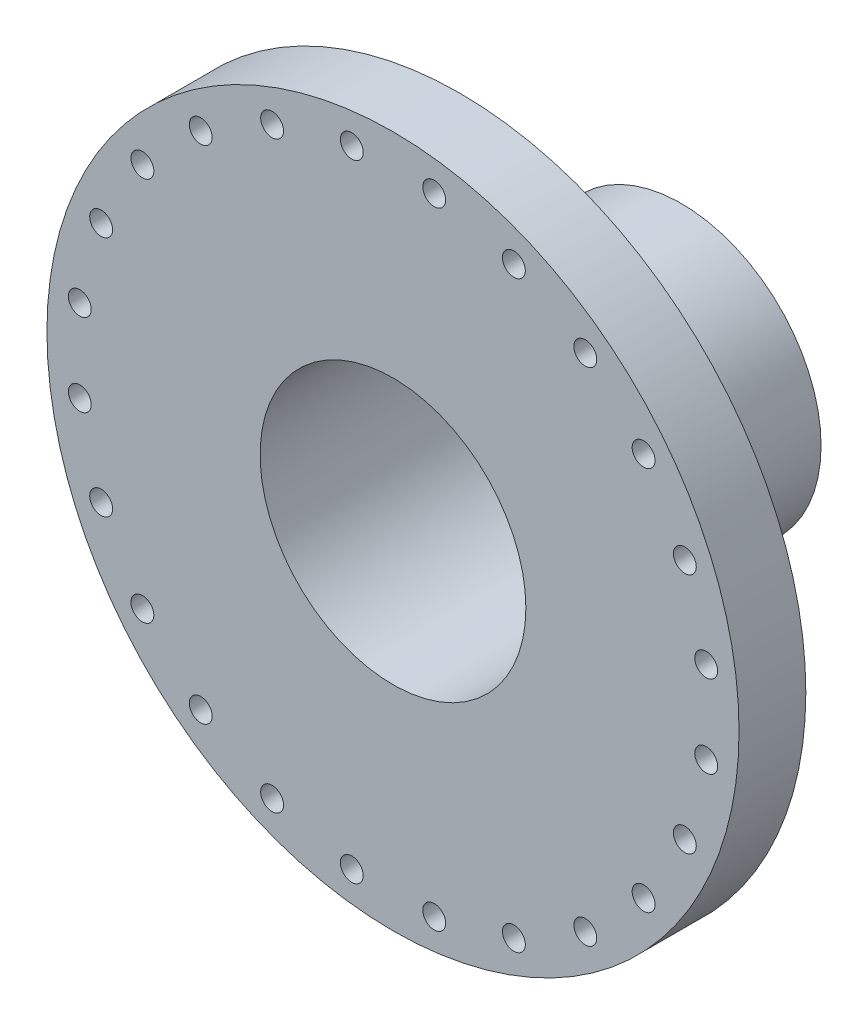
ISO-10303-21;
HEADER;
FILE_DESCRIPTION(('STEP AP214'),'2;1');
FILE_NAME('part.step','',(''),(''),'','','');
FILE_SCHEMA(('AUTOMOTIVE_DESIGN { 1 0 10303 214 1 1 1 1 }'));
ENDSEC;
DATA;
#1=APPLICATION_CONTEXT('core data for automotive mechanical design processes');
#2=APPLICATION_PROTOCOL_DEFINITION('international standard','automotive_design',2000,#1);
#3=PRODUCT_CONTEXT('',#1,'mechanical');
#4=PRODUCT('Part','Part','',(#3));
#5=PRODUCT_RELATED_PRODUCT_CATEGORY('part','',(#4));
#6=PRODUCT_DEFINITION_FORMATION('','',#4);
#7=PRODUCT_DEFINITION_CONTEXT('part definition',#1,'design');
#8=PRODUCT_DEFINITION('design','',#6,#7);
#9=PRODUCT_DEFINITION_SHAPE('','',#8);
#10=(LENGTH_UNIT() NAMED_UNIT(*) SI_UNIT(.MILLI.,.METRE.));
#11=(NAMED_UNIT(*) PLANE_ANGLE_UNIT() SI_UNIT($,.RADIAN.));
#12=(NAMED_UNIT(*) SI_UNIT($,.STERADIAN.) SOLID_ANGLE_UNIT());
#13=UNCERTAINTY_MEASURE_WITH_UNIT(LENGTH_MEASURE(1.E-05),#10,'distance_accuracy_value','');
#14=(GEOMETRIC_REPRESENTATION_CONTEXT(3) GLOBAL_UNCERTAINTY_ASSIGNED_CONTEXT((#13)) GLOBAL_UNIT_ASSIGNED_CONTEXT((#10,
#11,#12)) REPRESENTATION_CONTEXT('',''));
#15=CARTESIAN_POINT('',(0.,0.,0.));
#16=DIRECTION('',(0.,0.,1.));
#17=DIRECTION('',(1.,0.,0.));
#18=AXIS2_PLACEMENT_3D('',#15,#16,#17);
#19=CARTESIAN_POINT('',(0.,0.,-81.28));
#20=DIRECTION('',(0.,0.,1.));
#21=DIRECTION('',(1.,0.,0.));
#22=AXIS2_PLACEMENT_3D('',#19,#20,#21);
#23=CYLINDRICAL_SURFACE('',#22,48.768);
#24=CARTESIAN_POINT('',(0.,0.,24.511));
#25=DIRECTION('',(0.,0.,1.));
#26=DIRECTION('',(1.,0.,0.));
#27=AXIS2_PLACEMENT_3D('',#24,#25,#26);
#28=CIRCLE('',#27,48.768);
#29=CARTESIAN_POINT('',(48.768,0.,24.511));
#30=VERTEX_POINT('',#29);
#31=EDGE_CURVE('E50',#30,#30,#28,.T.);
#32=ORIENTED_EDGE('',*,*,#31,.T.);
#33=EDGE_LOOP('',(#32));
#34=FACE_BOUND('',#33,.T.);
#35=CARTESIAN_POINT('',(0.,0.,-78.74));
#36=DIRECTION('',(0.,0.,-1.));
#37=DIRECTION('',(-1.,0.,0.));
#38=AXIS2_PLACEMENT_3D('',#35,#36,#37);
#39=CIRCLE('',#38,48.768);
#40=CARTESIAN_POINT('',(-48.768,0.,-78.74));
#41=VERTEX_POINT('',#40);
#42=EDGE_CURVE('E10',#41,#41,#39,.F.);
#43=ORIENTED_EDGE('',*,*,#42,.F.);
#44=EDGE_LOOP('',(#43));
#45=FACE_BOUND('',#44,.T.);
#46=ADVANCED_FACE('F29',(#34,#45),#23,.F.);
#47=CARTESIAN_POINT('',(0.,0.,-81.28));
#48=DIRECTION('',(0.,0.,1.));
#49=DIRECTION('',(1.,0.,0.));
#50=AXIS2_PLACEMENT_3D('',#47,#48,#49);
#51=CYLINDRICAL_SURFACE('',#50,51.308);
#52=CARTESIAN_POINT('',(0.,0.,-81.28));
#53=DIRECTION('',(0.,0.,1.));
#54=DIRECTION('',(1.,0.,0.));
#55=AXIS2_PLACEMENT_3D('',#52,#53,#54);
#56=CIRCLE('',#55,51.308);
#57=CARTESIAN_POINT('',(51.308,0.,-81.28));
#58=VERTEX_POINT('',#57);
#59=EDGE_CURVE('E36',#58,#58,#56,.T.);
#60=ORIENTED_EDGE('',*,*,#59,.T.);
#61=EDGE_LOOP('',(#60));
#62=FACE_BOUND('',#61,.T.);
#63=CARTESIAN_POINT('',(0.,0.,0.));
#64=DIRECTION('',(0.,0.,1.));
#65=DIRECTION('',(1.,0.,0.));
#66=AXIS2_PLACEMENT_3D('',#63,#64,#65);
#67=CIRCLE('',#66,51.308);
#68=CARTESIAN_POINT('',(51.308,0.,0.));
#69=VERTEX_POINT('',#68);
#70=EDGE_CURVE('E40',#69,#69,#67,.T.);
#71=ORIENTED_EDGE('',*,*,#70,.F.);
#72=EDGE_LOOP('',(#71));
#73=FACE_BOUND('',#72,.T.);
#74=ADVANCED_FACE('F31',(#62,#73),#51,.T.);
#75=CARTESIAN_POINT('',(0.,0.,-81.28));
#76=DIRECTION('',(0.,0.,1.));
#77=DIRECTION('',(1.,0.,0.));
#78=AXIS2_PLACEMENT_3D('',#75,#76,#77);
#79=PLANE('',#78);
#80=ORIENTED_EDGE('',*,*,#59,.F.);
#81=EDGE_LOOP('',(#80));
#82=FACE_BOUND('',#81,.T.);
#83=CARTESIAN_POINT('',(0.,0.,-81.28));
#84=DIRECTION('',(0.,0.,-1.));
#85=DIRECTION('',(-1.,0.,0.));
#86=AXIS2_PLACEMENT_3D('',#83,#84,#85);
#87=CIRCLE('',#86,25.4);
#88=CARTESIAN_POINT('',(-25.4,0.,-81.28));
#89=VERTEX_POINT('',#88);
#90=EDGE_CURVE('E200',#89,#89,#87,.T.);
#91=ORIENTED_EDGE('',*,*,#90,.F.);
#92=EDGE_LOOP('',(#91));
#93=FACE_BOUND('',#92,.T.);
#94=ADVANCED_FACE('F214',(#82,#93),#79,.F.);
#95=CARTESIAN_POINT('',(0.,0.,24.511));
#96=DIRECTION('',(0.,0.,1.));
#97=DIRECTION('',(1.,0.,0.));
#98=AXIS2_PLACEMENT_3D('',#95,#96,#97);
#99=PLANE('',#98);
#100=CARTESIAN_POINT('',(-15.1313271488224,-114.933840421676,24.511));
#101=DIRECTION('',(0.,0.,1.));
#102=DIRECTION('',(0.965925826289072,-0.258819045102508,0.));
#103=AXIS2_PLACEMENT_3D('',#100,#101,#102);
#104=CIRCLE('',#103,4.20000000000002);
#105=CARTESIAN_POINT('',(-11.0744386784083,-116.020880411107,24.511));
#106=VERTEX_POINT('',#105);
#107=EDGE_CURVE('E196',#106,#106,#104,.T.);
#108=ORIENTED_EDGE('',*,*,#107,.F.);
#109=EDGE_LOOP('',(#108));
#110=FACE_BOUND('',#109,.T.);
#111=CARTESIAN_POINT('',(-44.3628065069803,-107.101289134091,24.511));
#112=DIRECTION('',(0.,0.,1.));
#113=DIRECTION('',(0.866025403784445,-0.499999999999989,0.));
#114=AXIS2_PLACEMENT_3D('',#111,#112,#113);
#115=CIRCLE('',#114,4.20000000000002);
#116=CARTESIAN_POINT('',(-40.7254998110856,-109.201289134091,24.511));
#117=VERTEX_POINT('',#116);
#118=EDGE_CURVE('E190',#117,#117,#115,.T.);
#119=ORIENTED_EDGE('',*,*,#118,.F.);
#120=EDGE_LOOP('',(#119));
#121=FACE_BOUND('',#120,.T.);
#122=CARTESIAN_POINT('',(-70.5710339146915,-91.969961985267,24.511));
#123=DIRECTION('',(0.,0.,1.));
#124=DIRECTION('',(0.707106781186556,-0.707106781186539,0.));
#125=AXIS2_PLACEMENT_3D('',#122,#123,#124);
#126=CIRCLE('',#125,4.20000000000002);
#127=CARTESIAN_POINT('',(-67.601185433708,-94.9398104662504,24.511));
#128=VERTEX_POINT('',#127);
#129=EDGE_CURVE('E184',#128,#128,#126,.T.);
#130=ORIENTED_EDGE('',*,*,#129,.F.);
#131=EDGE_LOOP('',(#130));
#132=FACE_BOUND('',#131,.T.);
#133=CARTESIAN_POINT('',(-91.9699619852642,-70.5710339146951,24.511));
#134=DIRECTION('',(0.,0.,1.));
#135=DIRECTION('',(0.50000000000001,-0.866025403784433,0.));
#136=AXIS2_PLACEMENT_3D('',#133,#134,#135);
#137=CIRCLE('',#136,4.20000000000002);
#138=CARTESIAN_POINT('',(-89.8699619852642,-74.2083406105897,24.511));
#139=VERTEX_POINT('',#138);
#140=EDGE_CURVE('E178',#139,#139,#137,.T.);
#141=ORIENTED_EDGE('',*,*,#140,.F.);
#142=EDGE_LOOP('',(#141));
#143=FACE_BOUND('',#142,.T.);
#144=CARTESIAN_POINT('',(-107.10128913409,-44.3628065069844,24.511));
#145=DIRECTION('',(0.,0.,1.));
#146=DIRECTION('',(0.258819045102531,-0.965925826289065,0.));
#147=AXIS2_PLACEMENT_3D('',#144,#145,#146);
#148=CIRCLE('',#147,4.20000000000002);
#149=CARTESIAN_POINT('',(-106.014249144659,-48.4196949773985,24.511));
#150=VERTEX_POINT('',#149);
#151=EDGE_CURVE('E172',#150,#150,#148,.T.);
#152=ORIENTED_EDGE('',*,*,#151,.F.);
#153=EDGE_LOOP('',(#152));
#154=FACE_BOUND('',#153,.T.);
#155=CARTESIAN_POINT('',(-114.933840421676,-15.1313271488269,24.511));
#156=DIRECTION('',(0.,0.,1.));
#157=DIRECTION('',(0.,-1.,0.));
#158=AXIS2_PLACEMENT_3D('',#155,#156,#157);
#159=CIRCLE('',#158,4.20000000000002);
#160=CARTESIAN_POINT('',(-114.933840421675,-19.3313271488269,24.511));
#161=VERTEX_POINT('',#160);
#162=EDGE_CURVE('E166',#161,#161,#159,.T.);
#163=ORIENTED_EDGE('',*,*,#162,.F.);
#164=EDGE_LOOP('',(#163));
#165=FACE_BOUND('',#164,.T.);
#166=CARTESIAN_POINT('',(-114.933840421676,15.1313271488228,24.511));
#167=DIRECTION('',(0.,0.,1.));
#168=DIRECTION('',(-0.258819045102511,-0.965925826289071,0.));
#169=AXIS2_PLACEMENT_3D('',#166,#167,#168);
#170=CIRCLE('',#169,4.20000000000002);
#171=CARTESIAN_POINT('',(-116.020880411107,11.0744386784087,24.511));
#172=VERTEX_POINT('',#171);
#173=EDGE_CURVE('E160',#172,#172,#170,.T.);
#174=ORIENTED_EDGE('',*,*,#173,.F.);
#175=EDGE_LOOP('',(#174));
#176=FACE_BOUND('',#175,.T.);
#177=CARTESIAN_POINT('',(-107.101289134091,44.3628065069807,24.511));
#178=DIRECTION('',(0.,0.,1.));
#179=DIRECTION('',(-0.499999999999992,-0.866025403784443,0.));
#180=AXIS2_PLACEMENT_3D('',#177,#178,#179);
#181=CIRCLE('',#180,4.20000000000002);
#182=CARTESIAN_POINT('',(-109.201289134091,40.725499811086,24.511));
#183=VERTEX_POINT('',#182);
#184=EDGE_CURVE('E154',#183,#183,#181,.T.);
#185=ORIENTED_EDGE('',*,*,#184,.F.);
#186=EDGE_LOOP('',(#185));
#187=FACE_BOUND('',#186,.T.);
#188=CARTESIAN_POINT('',(-91.9699619852667,70.5710339146919,24.511));
#189=DIRECTION('',(0.,0.,1.));
#190=DIRECTION('',(-0.707106781186541,-0.707106781186554,0.));
#191=AXIS2_PLACEMENT_3D('',#188,#189,#190);
#192=CIRCLE('',#191,4.20000000000002);
#193=CARTESIAN_POINT('',(-94.9398104662502,67.6011854337083,24.511));
#194=VERTEX_POINT('',#193);
#195=EDGE_CURVE('E148',#194,#194,#192,.T.);
#196=ORIENTED_EDGE('',*,*,#195,.F.);
#197=EDGE_LOOP('',(#196));
#198=FACE_BOUND('',#197,.T.);
#199=CARTESIAN_POINT('',(-70.5710339146947,91.9699619852645,24.511));
#200=DIRECTION('',(0.,0.,1.));
#201=DIRECTION('',(-0.866025403784435,-0.500000000000007,0.));
#202=AXIS2_PLACEMENT_3D('',#199,#200,#201);
#203=CIRCLE('',#202,4.20000000000002);
#204=CARTESIAN_POINT('',(-74.2083406105894,89.8699619852645,24.511));
#205=VERTEX_POINT('',#204);
#206=EDGE_CURVE('E142',#205,#205,#203,.T.);
#207=ORIENTED_EDGE('',*,*,#206,.F.);
#208=EDGE_LOOP('',(#207));
#209=FACE_BOUND('',#208,.T.);
#210=CARTESIAN_POINT('',(-44.362806506984,107.10128913409,24.511));
#211=DIRECTION('',(0.,0.,1.));
#212=DIRECTION('',(-0.965925826289066,-0.258819045102528,0.));
#213=AXIS2_PLACEMENT_3D('',#210,#211,#212);
#214=CIRCLE('',#213,4.20000000000002);
#215=CARTESIAN_POINT('',(-48.4196949773981,106.014249144659,24.511));
#216=VERTEX_POINT('',#215);
#217=EDGE_CURVE('E136',#216,#216,#214,.T.);
#218=ORIENTED_EDGE('',*,*,#217,.F.);
#219=EDGE_LOOP('',(#218));
#220=FACE_BOUND('',#219,.T.);
#221=CARTESIAN_POINT('',(-15.1313271488265,114.933840421676,24.511));
#222=DIRECTION('',(0.,0.,1.));
#223=DIRECTION('',(-1.,0.,0.));
#224=AXIS2_PLACEMENT_3D('',#221,#222,#223);
#225=CIRCLE('',#224,4.20000000000002);
#226=CARTESIAN_POINT('',(-19.3313271488265,114.933840421676,24.511));
#227=VERTEX_POINT('',#226);
#228=EDGE_CURVE('E130',#227,#227,#225,.T.);
#229=ORIENTED_EDGE('',*,*,#228,.F.);
#230=EDGE_LOOP('',(#229));
#231=FACE_BOUND('',#230,.T.);
#232=CARTESIAN_POINT('',(15.1313271488232,114.933840421676,24.511));
#233=DIRECTION('',(0.,0.,1.));
#234=DIRECTION('',(-0.96592582628907,0.258819045102515,0.));
#235=AXIS2_PLACEMENT_3D('',#232,#233,#234);
#236=CIRCLE('',#235,4.20000000000002);
#237=CARTESIAN_POINT('',(11.0744386784091,116.020880411107,24.511));
#238=VERTEX_POINT('',#237);
#239=EDGE_CURVE('E124',#238,#238,#236,.T.);
#240=ORIENTED_EDGE('',*,*,#239,.F.);
#241=EDGE_LOOP('',(#240));
#242=FACE_BOUND('',#241,.T.);
#243=CARTESIAN_POINT('',(44.362806506981,107.101289134091,24.511));
#244=DIRECTION('',(0.,0.,1.));
#245=DIRECTION('',(-0.866025403784442,0.499999999999995,0.));
#246=AXIS2_PLACEMENT_3D('',#243,#244,#245);
#247=CIRCLE('',#246,4.20000000000002);
#248=CARTESIAN_POINT('',(40.7254998110864,109.201289134091,24.511));
#249=VERTEX_POINT('',#248);
#250=EDGE_CURVE('E118',#249,#249,#247,.T.);
#251=ORIENTED_EDGE('',*,*,#250,.F.);
#252=EDGE_LOOP('',(#251));
#253=FACE_BOUND('',#252,.T.);
#254=CARTESIAN_POINT('',(70.5710339146922,91.9699619852665,24.511));
#255=DIRECTION('',(0.,0.,1.));
#256=DIRECTION('',(-0.707106781186551,0.707106781186544,0.));
#257=AXIS2_PLACEMENT_3D('',#254,#255,#256);
#258=CIRCLE('',#257,4.20000000000002);
#259=CARTESIAN_POINT('',(67.6011854337087,94.93981046625,24.511));
#260=VERTEX_POINT('',#259);
#261=EDGE_CURVE('E112',#260,#260,#258,.T.);
#262=ORIENTED_EDGE('',*,*,#261,.F.);
#263=EDGE_LOOP('',(#262));
#264=FACE_BOUND('',#263,.T.);
#265=CARTESIAN_POINT('',(91.9699619852648,70.5710339146945,24.511));
#266=DIRECTION('',(0.,0.,1.));
#267=DIRECTION('',(-0.500000000000004,0.866025403784436,0.));
#268=AXIS2_PLACEMENT_3D('',#265,#266,#267);
#269=CIRCLE('',#268,4.20000000000002);
#270=CARTESIAN_POINT('',(89.8699619852648,74.2083406105891,24.511));
#271=VERTEX_POINT('',#270);
#272=EDGE_CURVE('E106',#271,#271,#269,.T.);
#273=ORIENTED_EDGE('',*,*,#272,.F.);
#274=EDGE_LOOP('',(#273));
#275=FACE_BOUND('',#274,.T.);
#276=CARTESIAN_POINT('',(107.10128913409,44.3628065069837,24.511));
#277=DIRECTION('',(0.,0.,1.));
#278=DIRECTION('',(-0.258819045102525,0.965925826289067,0.));
#279=AXIS2_PLACEMENT_3D('',#276,#277,#278);
#280=CIRCLE('',#279,4.20000000000002);
#281=CARTESIAN_POINT('',(106.014249144659,48.4196949773978,24.511));
#282=VERTEX_POINT('',#281);
#283=EDGE_CURVE('E100',#282,#282,#280,.T.);
#284=ORIENTED_EDGE('',*,*,#283,.F.);
#285=EDGE_LOOP('',(#284));
#286=FACE_BOUND('',#285,.T.);
#287=CARTESIAN_POINT('',(114.933840421676,15.131327148826,24.511));
#288=DIRECTION('',(0.,0.,1.));
#289=DIRECTION('',(0.,1.,0.));
#290=AXIS2_PLACEMENT_3D('',#287,#288,#289);
#291=CIRCLE('',#290,4.20000000000002);
#292=CARTESIAN_POINT('',(114.933840421676,19.3313271488261,24.511));
#293=VERTEX_POINT('',#292);
#294=EDGE_CURVE('E94',#293,#293,#291,.T.);
#295=ORIENTED_EDGE('',*,*,#294,.F.);
#296=EDGE_LOOP('',(#295));
#297=FACE_BOUND('',#296,.T.);
#298=CARTESIAN_POINT('',(114.933840421676,-15.1313271488236,24.511));
#299=DIRECTION('',(0.,0.,1.));
#300=DIRECTION('',(0.258819045102518,0.965925826289069,0.));
#301=AXIS2_PLACEMENT_3D('',#298,#299,#300);
#302=CIRCLE('',#301,4.20000000000002);
#303=CARTESIAN_POINT('',(116.020880411107,-11.0744386784095,24.511));
#304=VERTEX_POINT('',#303);
#305=EDGE_CURVE('E88',#304,#304,#302,.T.);
#306=ORIENTED_EDGE('',*,*,#305,.F.);
#307=EDGE_LOOP('',(#306));
#308=FACE_BOUND('',#307,.T.);
#309=CARTESIAN_POINT('',(107.101289134091,-44.3628065069814,24.511));
#310=DIRECTION('',(0.,0.,1.));
#311=DIRECTION('',(0.499999999999998,0.86602540378444,0.));
#312=AXIS2_PLACEMENT_3D('',#309,#310,#311);
#313=CIRCLE('',#312,4.20000000000002);
#314=CARTESIAN_POINT('',(109.201289134091,-40.7254998110868,24.511));
#315=VERTEX_POINT('',#314);
#316=EDGE_CURVE('E82',#315,#315,#313,.T.);
#317=ORIENTED_EDGE('',*,*,#316,.F.);
#318=EDGE_LOOP('',(#317));
#319=FACE_BOUND('',#318,.T.);
#320=CARTESIAN_POINT('',(91.9699619852663,-70.5710339146925,24.511));
#321=DIRECTION('',(0.,0.,1.));
#322=DIRECTION('',(0.707106781186546,0.707106781186549,0.));
#323=AXIS2_PLACEMENT_3D('',#320,#321,#322);
#324=CIRCLE('',#323,4.20000000000002);
#325=CARTESIAN_POINT('',(94.9398104662498,-67.601185433709,24.511));
#326=VERTEX_POINT('',#325);
#327=EDGE_CURVE('E76',#326,#326,#324,.T.);
#328=ORIENTED_EDGE('',*,*,#327,.F.);
#329=EDGE_LOOP('',(#328));
#330=FACE_BOUND('',#329,.T.);
#331=CARTESIAN_POINT('',(70.5710339146942,-91.969961985265,24.511));
#332=DIRECTION('',(0.,0.,1.));
#333=DIRECTION('',(0.866025403784438,0.500000000000001,0.));
#334=AXIS2_PLACEMENT_3D('',#331,#332,#333);
#335=CIRCLE('',#334,4.20000000000002);
#336=CARTESIAN_POINT('',(74.2083406105888,-89.869961985265,24.511));
#337=VERTEX_POINT('',#336);
#338=EDGE_CURVE('E70',#337,#337,#335,.T.);
#339=ORIENTED_EDGE('',*,*,#338,.F.);
#340=EDGE_LOOP('',(#339));
#341=FACE_BOUND('',#340,.T.);
#342=CARTESIAN_POINT('',(44.3628065069833,-107.10128913409,24.511));
#343=DIRECTION('',(0.,0.,1.));
#344=DIRECTION('',(0.965925826289068,0.258819045102521,0.));
#345=AXIS2_PLACEMENT_3D('',#342,#343,#344);
#346=CIRCLE('',#345,4.20000000000002);
#347=CARTESIAN_POINT('',(48.4196949773974,-106.014249144659,24.511));
#348=VERTEX_POINT('',#347);
#349=EDGE_CURVE('E64',#348,#348,#346,.T.);
#350=ORIENTED_EDGE('',*,*,#349,.F.);
#351=EDGE_LOOP('',(#350));
#352=FACE_BOUND('',#351,.T.);
#353=CARTESIAN_POINT('',(15.1313271488256,-114.933840421676,24.511));
#354=DIRECTION('',(0.,0.,1.));
#355=DIRECTION('',(1.,0.,0.));
#356=AXIS2_PLACEMENT_3D('',#353,#354,#355);
#357=CIRCLE('',#356,4.20000000000002);
#358=CARTESIAN_POINT('',(19.3313271488257,-114.933840421676,24.511));
#359=VERTEX_POINT('',#358);
#360=EDGE_CURVE('E58',#359,#359,#357,.T.);
#361=ORIENTED_EDGE('',*,*,#360,.F.);
#362=EDGE_LOOP('',(#361));
#363=FACE_BOUND('',#362,.T.);
#364=CARTESIAN_POINT('',(0.,0.,24.511));
#365=DIRECTION('',(0.,0.,1.));
#366=DIRECTION('',(1.,0.,0.));
#367=AXIS2_PLACEMENT_3D('',#364,#365,#366);
#368=CIRCLE('',#367,127.);
#369=CARTESIAN_POINT('',(127.,0.,24.511));
#370=VERTEX_POINT('',#369);
#371=EDGE_CURVE('E45',#370,#370,#368,.T.);
#372=ORIENTED_EDGE('',*,*,#371,.T.);
#373=EDGE_LOOP('',(#372));
#374=FACE_BOUND('',#373,.T.);
#375=ORIENTED_EDGE('',*,*,#31,.F.);
#376=EDGE_LOOP('',(#375));
#377=FACE_BOUND('',#376,.T.);
#378=ADVANCED_FACE('F216',(#110,#121,#132,#143,#154,#165,#176,#187,#198,#209,#220,#231,#242,
#253,#264,#275,#286,#297,#308,#319,#330,#341,#352,#363,#374,#377),#99,.T.);
#379=CARTESIAN_POINT('',(0.,0.,0.));
#380=DIRECTION('',(0.,0.,1.));
#381=DIRECTION('',(1.,0.,0.));
#382=AXIS2_PLACEMENT_3D('',#379,#380,#381);
#383=PLANE('',#382);
#384=CARTESIAN_POINT('',(-15.1313271488224,-114.933840421676,0.));
#385=DIRECTION('',(0.,0.,1.));
#386=DIRECTION('',(1.,0.,0.));
#387=AXIS2_PLACEMENT_3D('',#384,#385,#386);
#388=CIRCLE('',#387,4.20000000000002);
#389=CARTESIAN_POINT('',(-10.9313271488224,-114.933840421676,0.));
#390=VERTEX_POINT('',#389);
#391=EDGE_CURVE('E193',#390,#390,#388,.F.);
#392=ORIENTED_EDGE('',*,*,#391,.F.);
#393=EDGE_LOOP('',(#392));
#394=FACE_BOUND('',#393,.T.);
#395=CARTESIAN_POINT('',(-44.3628065069803,-107.101289134091,0.));
#396=DIRECTION('',(0.,0.,1.));
#397=DIRECTION('',(1.,0.,0.));
#398=AXIS2_PLACEMENT_3D('',#395,#396,#397);
#399=CIRCLE('',#398,4.20000000000002);
#400=CARTESIAN_POINT('',(-40.1628065069803,-107.101289134091,0.));
#401=VERTEX_POINT('',#400);
#402=EDGE_CURVE('E187',#401,#401,#399,.F.);
#403=ORIENTED_EDGE('',*,*,#402,.F.);
#404=EDGE_LOOP('',(#403));
#405=FACE_BOUND('',#404,.T.);
#406=CARTESIAN_POINT('',(-70.5710339146916,-91.969961985267,0.));
#407=DIRECTION('',(0.,0.,1.));
#408=DIRECTION('',(1.,0.,0.));
#409=AXIS2_PLACEMENT_3D('',#406,#407,#408);
#410=CIRCLE('',#409,4.20000000000002);
#411=CARTESIAN_POINT('',(-66.3710339146915,-91.969961985267,0.));
#412=VERTEX_POINT('',#411);
#413=EDGE_CURVE('E181',#412,#412,#410,.F.);
#414=ORIENTED_EDGE('',*,*,#413,.F.);
#415=EDGE_LOOP('',(#414));
#416=FACE_BOUND('',#415,.T.);
#417=CARTESIAN_POINT('',(-91.9699619852643,-70.5710339146951,0.));
#418=DIRECTION('',(0.,0.,1.));
#419=DIRECTION('',(1.,0.,0.));
#420=AXIS2_PLACEMENT_3D('',#417,#418,#419);
#421=CIRCLE('',#420,4.20000000000002);
#422=CARTESIAN_POINT('',(-87.7699619852642,-70.5710339146951,0.));
#423=VERTEX_POINT('',#422);
#424=EDGE_CURVE('E175',#423,#423,#421,.F.);
#425=ORIENTED_EDGE('',*,*,#424,.F.);
#426=EDGE_LOOP('',(#425));
#427=FACE_BOUND('',#426,.T.);
#428=CARTESIAN_POINT('',(-107.10128913409,-44.3628065069844,0.));
#429=DIRECTION('',(0.,0.,1.));
#430=DIRECTION('',(1.,0.,0.));
#431=AXIS2_PLACEMENT_3D('',#428,#429,#430);
#432=CIRCLE('',#431,4.20000000000002);
#433=CARTESIAN_POINT('',(-102.90128913409,-44.3628065069844,0.));
#434=VERTEX_POINT('',#433);
#435=EDGE_CURVE('E169',#434,#434,#432,.F.);
#436=ORIENTED_EDGE('',*,*,#435,.F.);
#437=EDGE_LOOP('',(#436));
#438=FACE_BOUND('',#437,.T.);
#439=CARTESIAN_POINT('',(-114.933840421676,-15.1313271488269,0.));
#440=DIRECTION('',(0.,0.,1.));
#441=DIRECTION('',(1.,0.,0.));
#442=AXIS2_PLACEMENT_3D('',#439,#440,#441);
#443=CIRCLE('',#442,4.20000000000002);
#444=CARTESIAN_POINT('',(-110.733840421676,-15.1313271488269,0.));
#445=VERTEX_POINT('',#444);
#446=EDGE_CURVE('E163',#445,#445,#443,.F.);
#447=ORIENTED_EDGE('',*,*,#446,.F.);
#448=EDGE_LOOP('',(#447));
#449=FACE_BOUND('',#448,.T.);
#450=CARTESIAN_POINT('',(-114.933840421676,15.1313271488228,0.));
#451=DIRECTION('',(0.,0.,1.));
#452=DIRECTION('',(1.,0.,0.));
#453=AXIS2_PLACEMENT_3D('',#450,#451,#452);
#454=CIRCLE('',#453,4.20000000000002);
#455=CARTESIAN_POINT('',(-110.733840421676,15.1313271488228,0.));
#456=VERTEX_POINT('',#455);
#457=EDGE_CURVE('E157',#456,#456,#454,.F.);
#458=ORIENTED_EDGE('',*,*,#457,.F.);
#459=EDGE_LOOP('',(#458));
#460=FACE_BOUND('',#459,.T.);
#461=CARTESIAN_POINT('',(-107.101289134091,44.3628065069807,0.));
#462=DIRECTION('',(0.,0.,1.));
#463=DIRECTION('',(1.,0.,0.));
#464=AXIS2_PLACEMENT_3D('',#461,#462,#463);
#465=CIRCLE('',#464,4.20000000000002);
#466=CARTESIAN_POINT('',(-102.901289134091,44.3628065069807,0.));
#467=VERTEX_POINT('',#466);
#468=EDGE_CURVE('E151',#467,#467,#465,.F.);
#469=ORIENTED_EDGE('',*,*,#468,.F.);
#470=EDGE_LOOP('',(#469));
#471=FACE_BOUND('',#470,.T.);
#472=CARTESIAN_POINT('',(-91.9699619852667,70.5710339146919,0.));
#473=DIRECTION('',(0.,0.,1.));
#474=DIRECTION('',(1.,0.,0.));
#475=AXIS2_PLACEMENT_3D('',#472,#473,#474);
#476=CIRCLE('',#475,4.20000000000002);
#477=CARTESIAN_POINT('',(-87.7699619852667,70.5710339146919,0.));
#478=VERTEX_POINT('',#477);
#479=EDGE_CURVE('E145',#478,#478,#476,.F.);
#480=ORIENTED_EDGE('',*,*,#479,.F.);
#481=EDGE_LOOP('',(#480));
#482=FACE_BOUND('',#481,.T.);
#483=CARTESIAN_POINT('',(-70.5710339146948,91.9699619852645,0.));
#484=DIRECTION('',(0.,0.,1.));
#485=DIRECTION('',(1.,0.,0.));
#486=AXIS2_PLACEMENT_3D('',#483,#484,#485);
#487=CIRCLE('',#486,4.20000000000002);
#488=CARTESIAN_POINT('',(-66.3710339146948,91.9699619852645,0.));
#489=VERTEX_POINT('',#488);
#490=EDGE_CURVE('E139',#489,#489,#487,.F.);
#491=ORIENTED_EDGE('',*,*,#490,.F.);
#492=EDGE_LOOP('',(#491));
#493=FACE_BOUND('',#492,.T.);
#494=CARTESIAN_POINT('',(-44.362806506984,107.10128913409,0.));
#495=DIRECTION('',(0.,0.,1.));
#496=DIRECTION('',(1.,0.,0.));
#497=AXIS2_PLACEMENT_3D('',#494,#495,#496);
#498=CIRCLE('',#497,4.20000000000002);
#499=CARTESIAN_POINT('',(-40.162806506984,107.10128913409,0.));
#500=VERTEX_POINT('',#499);
#501=EDGE_CURVE('E133',#500,#500,#498,.F.);
#502=ORIENTED_EDGE('',*,*,#501,.F.);
#503=EDGE_LOOP('',(#502));
#504=FACE_BOUND('',#503,.T.);
#505=CARTESIAN_POINT('',(-15.1313271488265,114.933840421676,0.));
#506=DIRECTION('',(0.,0.,1.));
#507=DIRECTION('',(1.,0.,0.));
#508=AXIS2_PLACEMENT_3D('',#505,#506,#507);
#509=CIRCLE('',#508,4.20000000000002);
#510=CARTESIAN_POINT('',(-10.9313271488264,114.933840421676,0.));
#511=VERTEX_POINT('',#510);
#512=EDGE_CURVE('E127',#511,#511,#509,.F.);
#513=ORIENTED_EDGE('',*,*,#512,.F.);
#514=EDGE_LOOP('',(#513));
#515=FACE_BOUND('',#514,.T.);
#516=CARTESIAN_POINT('',(15.1313271488232,114.933840421676,0.));
#517=DIRECTION('',(0.,0.,1.));
#518=DIRECTION('',(1.,0.,0.));
#519=AXIS2_PLACEMENT_3D('',#516,#517,#518);
#520=CIRCLE('',#519,4.20000000000002);
#521=CARTESIAN_POINT('',(19.3313271488233,114.933840421676,0.));
#522=VERTEX_POINT('',#521);
#523=EDGE_CURVE('E121',#522,#522,#520,.F.);
#524=ORIENTED_EDGE('',*,*,#523,.F.);
#525=EDGE_LOOP('',(#524));
#526=FACE_BOUND('',#525,.T.);
#527=CARTESIAN_POINT('',(44.362806506981,107.101289134091,0.));
#528=DIRECTION('',(0.,0.,1.));
#529=DIRECTION('',(1.,0.,0.));
#530=AXIS2_PLACEMENT_3D('',#527,#528,#529);
#531=CIRCLE('',#530,4.20000000000002);
#532=CARTESIAN_POINT('',(48.5628065069811,107.101289134091,0.));
#533=VERTEX_POINT('',#532);
#534=EDGE_CURVE('E115',#533,#533,#531,.F.);
#535=ORIENTED_EDGE('',*,*,#534,.F.);
#536=EDGE_LOOP('',(#535));
#537=FACE_BOUND('',#536,.T.);
#538=CARTESIAN_POINT('',(70.5710339146922,91.9699619852665,0.));
#539=DIRECTION('',(0.,0.,1.));
#540=DIRECTION('',(1.,0.,0.));
#541=AXIS2_PLACEMENT_3D('',#538,#539,#540);
#542=CIRCLE('',#541,4.20000000000002);
#543=CARTESIAN_POINT('',(74.7710339146922,91.9699619852665,0.));
#544=VERTEX_POINT('',#543);
#545=EDGE_CURVE('E109',#544,#544,#542,.F.);
#546=ORIENTED_EDGE('',*,*,#545,.F.);
#547=EDGE_LOOP('',(#546));
#548=FACE_BOUND('',#547,.T.);
#549=CARTESIAN_POINT('',(91.9699619852648,70.5710339146945,0.));
#550=DIRECTION('',(0.,0.,1.));
#551=DIRECTION('',(1.,0.,0.));
#552=AXIS2_PLACEMENT_3D('',#549,#550,#551);
#553=CIRCLE('',#552,4.20000000000002);
#554=CARTESIAN_POINT('',(96.1699619852648,70.5710339146945,0.));
#555=VERTEX_POINT('',#554);
#556=EDGE_CURVE('E103',#555,#555,#553,.F.);
#557=ORIENTED_EDGE('',*,*,#556,.F.);
#558=EDGE_LOOP('',(#557));
#559=FACE_BOUND('',#558,.T.);
#560=CARTESIAN_POINT('',(107.10128913409,44.3628065069837,0.));
#561=DIRECTION('',(0.,0.,1.));
#562=DIRECTION('',(1.,0.,0.));
#563=AXIS2_PLACEMENT_3D('',#560,#561,#562);
#564=CIRCLE('',#563,4.20000000000002);
#565=CARTESIAN_POINT('',(111.30128913409,44.3628065069837,0.));
#566=VERTEX_POINT('',#565);
#567=EDGE_CURVE('E97',#566,#566,#564,.F.);
#568=ORIENTED_EDGE('',*,*,#567,.F.);
#569=EDGE_LOOP('',(#568));
#570=FACE_BOUND('',#569,.T.);
#571=CARTESIAN_POINT('',(114.933840421676,15.131327148826,0.));
#572=DIRECTION('',(0.,0.,1.));
#573=DIRECTION('',(1.,0.,0.));
#574=AXIS2_PLACEMENT_3D('',#571,#572,#573);
#575=CIRCLE('',#574,4.20000000000002);
#576=CARTESIAN_POINT('',(119.133840421676,15.131327148826,0.));
#577=VERTEX_POINT('',#576);
#578=EDGE_CURVE('E91',#577,#577,#575,.F.);
#579=ORIENTED_EDGE('',*,*,#578,.F.);
#580=EDGE_LOOP('',(#579));
#581=FACE_BOUND('',#580,.T.);
#582=CARTESIAN_POINT('',(114.933840421676,-15.1313271488236,0.));
#583=DIRECTION('',(0.,0.,1.));
#584=DIRECTION('',(1.,0.,0.));
#585=AXIS2_PLACEMENT_3D('',#582,#583,#584);
#586=CIRCLE('',#585,4.20000000000002);
#587=CARTESIAN_POINT('',(119.133840421676,-15.1313271488236,0.));
#588=VERTEX_POINT('',#587);
#589=EDGE_CURVE('E85',#588,#588,#586,.F.);
#590=ORIENTED_EDGE('',*,*,#589,.F.);
#591=EDGE_LOOP('',(#590));
#592=FACE_BOUND('',#591,.T.);
#593=CARTESIAN_POINT('',(107.101289134091,-44.3628065069814,0.));
#594=DIRECTION('',(0.,0.,1.));
#595=DIRECTION('',(1.,0.,0.));
#596=AXIS2_PLACEMENT_3D('',#593,#594,#595);
#597=CIRCLE('',#596,4.20000000000002);
#598=CARTESIAN_POINT('',(111.301289134091,-44.3628065069814,0.));
#599=VERTEX_POINT('',#598);
#600=EDGE_CURVE('E79',#599,#599,#597,.F.);
#601=ORIENTED_EDGE('',*,*,#600,.F.);
#602=EDGE_LOOP('',(#601));
#603=FACE_BOUND('',#602,.T.);
#604=CARTESIAN_POINT('',(91.9699619852663,-70.5710339146925,0.));
#605=DIRECTION('',(0.,0.,1.));
#606=DIRECTION('',(1.,0.,0.));
#607=AXIS2_PLACEMENT_3D('',#604,#605,#606);
#608=CIRCLE('',#607,4.20000000000002);
#609=CARTESIAN_POINT('',(96.1699619852663,-70.5710339146925,0.));
#610=VERTEX_POINT('',#609);
#611=EDGE_CURVE('E73',#610,#610,#608,.F.);
#612=ORIENTED_EDGE('',*,*,#611,.F.);
#613=EDGE_LOOP('',(#612));
#614=FACE_BOUND('',#613,.T.);
#615=CARTESIAN_POINT('',(70.5710339146941,-91.969961985265,0.));
#616=DIRECTION('',(0.,0.,1.));
#617=DIRECTION('',(1.,0.,0.));
#618=AXIS2_PLACEMENT_3D('',#615,#616,#617);
#619=CIRCLE('',#618,4.20000000000002);
#620=CARTESIAN_POINT('',(74.7710339146941,-91.969961985265,0.));
#621=VERTEX_POINT('',#620);
#622=EDGE_CURVE('E67',#621,#621,#619,.F.);
#623=ORIENTED_EDGE('',*,*,#622,.F.);
#624=EDGE_LOOP('',(#623));
#625=FACE_BOUND('',#624,.T.);
#626=CARTESIAN_POINT('',(44.3628065069833,-107.10128913409,0.));
#627=DIRECTION('',(0.,0.,1.));
#628=DIRECTION('',(1.,0.,0.));
#629=AXIS2_PLACEMENT_3D('',#626,#627,#628);
#630=CIRCLE('',#629,4.20000000000002);
#631=CARTESIAN_POINT('',(48.5628065069833,-107.10128913409,0.));
#632=VERTEX_POINT('',#631);
#633=EDGE_CURVE('E61',#632,#632,#630,.F.);
#634=ORIENTED_EDGE('',*,*,#633,.F.);
#635=EDGE_LOOP('',(#634));
#636=FACE_BOUND('',#635,.T.);
#637=CARTESIAN_POINT('',(15.1313271488256,-114.933840421676,0.));
#638=DIRECTION('',(0.,0.,1.));
#639=DIRECTION('',(1.,0.,0.));
#640=AXIS2_PLACEMENT_3D('',#637,#638,#639);
#641=CIRCLE('',#640,4.20000000000002);
#642=CARTESIAN_POINT('',(19.3313271488257,-114.933840421676,0.));
#643=VERTEX_POINT('',#642);
#644=EDGE_CURVE('E55',#643,#643,#641,.F.);
#645=ORIENTED_EDGE('',*,*,#644,.F.);
#646=EDGE_LOOP('',(#645));
#647=FACE_BOUND('',#646,.T.);
#648=ORIENTED_EDGE('',*,*,#70,.T.);
#649=EDGE_LOOP('',(#648));
#650=FACE_BOUND('',#649,.T.);
#651=CARTESIAN_POINT('',(0.,0.,0.));
#652=DIRECTION('',(0.,0.,1.));
#653=DIRECTION('',(1.,0.,0.));
#654=AXIS2_PLACEMENT_3D('',#651,#652,#653);
#655=CIRCLE('',#654,127.);
#656=CARTESIAN_POINT('',(127.,0.,0.));
#657=VERTEX_POINT('',#656);
#658=EDGE_CURVE('E47',#657,#657,#655,.T.);
#659=ORIENTED_EDGE('',*,*,#658,.F.);
#660=EDGE_LOOP('',(#659));
#661=FACE_BOUND('',#660,.T.);
#662=ADVANCED_FACE('F222',(#394,#405,#416,#427,#438,#449,#460,#471,#482,#493,#504,#515,#526,
#537,#548,#559,#570,#581,#592,#603,#614,#625,#636,#647,#650,#661),#383,.F.);
#663=CARTESIAN_POINT('',(0.,0.,24.511));
#664=DIRECTION('',(0.,0.,-1.));
#665=DIRECTION('',(-1.,0.,0.));
#666=AXIS2_PLACEMENT_3D('',#663,#664,#665);
#667=CYLINDRICAL_SURFACE('',#666,127.);
#668=ORIENTED_EDGE('',*,*,#371,.F.);
#669=EDGE_LOOP('',(#668));
#670=FACE_BOUND('',#669,.T.);
#671=ORIENTED_EDGE('',*,*,#658,.T.);
#672=EDGE_LOOP('',(#671));
#673=FACE_BOUND('',#672,.T.);
#674=ADVANCED_FACE('F232',(#670,#673),#667,.T.);
#675=CARTESIAN_POINT('',(15.1313271488256,-114.933840421676,-81.281));
#676=DIRECTION('',(0.,0.,1.));
#677=DIRECTION('',(1.,0.,0.));
#678=AXIS2_PLACEMENT_3D('',#675,#676,#677);
#679=CYLINDRICAL_SURFACE('',#678,4.20000000000002);
#680=ORIENTED_EDGE('',*,*,#360,.T.);
#681=EDGE_LOOP('',(#680));
#682=FACE_BOUND('',#681,.T.);
#683=ORIENTED_EDGE('',*,*,#644,.T.);
#684=EDGE_LOOP('',(#683));
#685=FACE_BOUND('',#684,.T.);
#686=ADVANCED_FACE('F235',(#682,#685),#679,.F.);
#687=CARTESIAN_POINT('',(44.3628065069833,-107.10128913409,-81.2809999999999));
#688=DIRECTION('',(0.,0.,1.));
#689=DIRECTION('',(1.,0.,0.));
#690=AXIS2_PLACEMENT_3D('',#687,#688,#689);
#691=CYLINDRICAL_SURFACE('',#690,4.20000000000002);
#692=ORIENTED_EDGE('',*,*,#349,.T.);
#693=EDGE_LOOP('',(#692));
#694=FACE_BOUND('',#693,.T.);
#695=ORIENTED_EDGE('',*,*,#633,.T.);
#696=EDGE_LOOP('',(#695));
#697=FACE_BOUND('',#696,.T.);
#698=ADVANCED_FACE('F242',(#694,#697),#691,.F.);
#699=CARTESIAN_POINT('',(70.5710339146941,-91.969961985265,-81.281));
#700=DIRECTION('',(0.,0.,1.));
#701=DIRECTION('',(1.,0.,0.));
#702=AXIS2_PLACEMENT_3D('',#699,#700,#701);
#703=CYLINDRICAL_SURFACE('',#702,4.20000000000002);
#704=ORIENTED_EDGE('',*,*,#338,.T.);
#705=EDGE_LOOP('',(#704));
#706=FACE_BOUND('',#705,.T.);
#707=ORIENTED_EDGE('',*,*,#622,.T.);
#708=EDGE_LOOP('',(#707));
#709=FACE_BOUND('',#708,.T.);
#710=ADVANCED_FACE('F246',(#706,#709),#703,.F.);
#711=CARTESIAN_POINT('',(91.9699619852663,-70.5710339146925,-81.281));
#712=DIRECTION('',(0.,0.,1.));
#713=DIRECTION('',(1.,0.,0.));
#714=AXIS2_PLACEMENT_3D('',#711,#712,#713);
#715=CYLINDRICAL_SURFACE('',#714,4.20000000000002);
#716=ORIENTED_EDGE('',*,*,#327,.T.);
#717=EDGE_LOOP('',(#716));
#718=FACE_BOUND('',#717,.T.);
#719=ORIENTED_EDGE('',*,*,#611,.T.);
#720=EDGE_LOOP('',(#719));
#721=FACE_BOUND('',#720,.T.);
#722=ADVANCED_FACE('F250',(#718,#721),#715,.F.);
#723=CARTESIAN_POINT('',(107.101289134091,-44.3628065069814,-81.281));
#724=DIRECTION('',(0.,0.,1.));
#725=DIRECTION('',(1.,0.,0.));
#726=AXIS2_PLACEMENT_3D('',#723,#724,#725);
#727=CYLINDRICAL_SURFACE('',#726,4.20000000000002);
#728=ORIENTED_EDGE('',*,*,#316,.T.);
#729=EDGE_LOOP('',(#728));
#730=FACE_BOUND('',#729,.T.);
#731=ORIENTED_EDGE('',*,*,#600,.T.);
#732=EDGE_LOOP('',(#731));
#733=FACE_BOUND('',#732,.T.);
#734=ADVANCED_FACE('F254',(#730,#733),#727,.F.);
#735=CARTESIAN_POINT('',(114.933840421676,-15.1313271488236,-81.281));
#736=DIRECTION('',(0.,0.,1.));
#737=DIRECTION('',(1.,0.,0.));
#738=AXIS2_PLACEMENT_3D('',#735,#736,#737);
#739=CYLINDRICAL_SURFACE('',#738,4.20000000000002);
#740=ORIENTED_EDGE('',*,*,#305,.T.);
#741=EDGE_LOOP('',(#740));
#742=FACE_BOUND('',#741,.T.);
#743=ORIENTED_EDGE('',*,*,#589,.T.);
#744=EDGE_LOOP('',(#743));
#745=FACE_BOUND('',#744,.T.);
#746=ADVANCED_FACE('F258',(#742,#745),#739,.F.);
#747=CARTESIAN_POINT('',(114.933840421676,15.131327148826,-81.281));
#748=DIRECTION('',(0.,0.,1.));
#749=DIRECTION('',(1.,0.,0.));
#750=AXIS2_PLACEMENT_3D('',#747,#748,#749);
#751=CYLINDRICAL_SURFACE('',#750,4.20000000000002);
#752=ORIENTED_EDGE('',*,*,#294,.T.);
#753=EDGE_LOOP('',(#752));
#754=FACE_BOUND('',#753,.T.);
#755=ORIENTED_EDGE('',*,*,#578,.T.);
#756=EDGE_LOOP('',(#755));
#757=FACE_BOUND('',#756,.T.);
#758=ADVANCED_FACE('F262',(#754,#757),#751,.F.);
#759=CARTESIAN_POINT('',(107.10128913409,44.3628065069837,-81.281));
#760=DIRECTION('',(0.,0.,1.));
#761=DIRECTION('',(1.,0.,0.));
#762=AXIS2_PLACEMENT_3D('',#759,#760,#761);
#763=CYLINDRICAL_SURFACE('',#762,4.20000000000002);
#764=ORIENTED_EDGE('',*,*,#283,.T.);
#765=EDGE_LOOP('',(#764));
#766=FACE_BOUND('',#765,.T.);
#767=ORIENTED_EDGE('',*,*,#567,.T.);
#768=EDGE_LOOP('',(#767));
#769=FACE_BOUND('',#768,.T.);
#770=ADVANCED_FACE('F266',(#766,#769),#763,.F.);
#771=CARTESIAN_POINT('',(91.9699619852648,70.5710339146945,-81.281));
#772=DIRECTION('',(0.,0.,1.));
#773=DIRECTION('',(1.,0.,0.));
#774=AXIS2_PLACEMENT_3D('',#771,#772,#773);
#775=CYLINDRICAL_SURFACE('',#774,4.20000000000002);
#776=ORIENTED_EDGE('',*,*,#272,.T.);
#777=EDGE_LOOP('',(#776));
#778=FACE_BOUND('',#777,.T.);
#779=ORIENTED_EDGE('',*,*,#556,.T.);
#780=EDGE_LOOP('',(#779));
#781=FACE_BOUND('',#780,.T.);
#782=ADVANCED_FACE('F270',(#778,#781),#775,.F.);
#783=CARTESIAN_POINT('',(70.5710339146922,91.9699619852665,-81.281));
#784=DIRECTION('',(0.,0.,1.));
#785=DIRECTION('',(1.,0.,0.));
#786=AXIS2_PLACEMENT_3D('',#783,#784,#785);
#787=CYLINDRICAL_SURFACE('',#786,4.20000000000002);
#788=ORIENTED_EDGE('',*,*,#261,.T.);
#789=EDGE_LOOP('',(#788));
#790=FACE_BOUND('',#789,.T.);
#791=ORIENTED_EDGE('',*,*,#545,.T.);
#792=EDGE_LOOP('',(#791));
#793=FACE_BOUND('',#792,.T.);
#794=ADVANCED_FACE('F274',(#790,#793),#787,.F.);
#795=CARTESIAN_POINT('',(44.362806506981,107.101289134091,-81.281));
#796=DIRECTION('',(0.,0.,1.));
#797=DIRECTION('',(1.,0.,0.));
#798=AXIS2_PLACEMENT_3D('',#795,#796,#797);
#799=CYLINDRICAL_SURFACE('',#798,4.20000000000002);
#800=ORIENTED_EDGE('',*,*,#250,.T.);
#801=EDGE_LOOP('',(#800));
#802=FACE_BOUND('',#801,.T.);
#803=ORIENTED_EDGE('',*,*,#534,.T.);
#804=EDGE_LOOP('',(#803));
#805=FACE_BOUND('',#804,.T.);
#806=ADVANCED_FACE('F278',(#802,#805),#799,.F.);
#807=CARTESIAN_POINT('',(15.1313271488232,114.933840421676,-81.281));
#808=DIRECTION('',(0.,0.,1.));
#809=DIRECTION('',(1.,0.,0.));
#810=AXIS2_PLACEMENT_3D('',#807,#808,#809);
#811=CYLINDRICAL_SURFACE('',#810,4.20000000000002);
#812=ORIENTED_EDGE('',*,*,#239,.T.);
#813=EDGE_LOOP('',(#812));
#814=FACE_BOUND('',#813,.T.);
#815=ORIENTED_EDGE('',*,*,#523,.T.);
#816=EDGE_LOOP('',(#815));
#817=FACE_BOUND('',#816,.T.);
#818=ADVANCED_FACE('F282',(#814,#817),#811,.F.);
#819=CARTESIAN_POINT('',(-15.1313271488265,114.933840421676,-81.281));
#820=DIRECTION('',(0.,0.,1.));
#821=DIRECTION('',(1.,0.,0.));
#822=AXIS2_PLACEMENT_3D('',#819,#820,#821);
#823=CYLINDRICAL_SURFACE('',#822,4.20000000000002);
#824=ORIENTED_EDGE('',*,*,#228,.T.);
#825=EDGE_LOOP('',(#824));
#826=FACE_BOUND('',#825,.T.);
#827=ORIENTED_EDGE('',*,*,#512,.T.);
#828=EDGE_LOOP('',(#827));
#829=FACE_BOUND('',#828,.T.);
#830=ADVANCED_FACE('F286',(#826,#829),#823,.F.);
#831=CARTESIAN_POINT('',(-44.362806506984,107.10128913409,-81.281));
#832=DIRECTION('',(0.,0.,1.));
#833=DIRECTION('',(1.,0.,0.));
#834=AXIS2_PLACEMENT_3D('',#831,#832,#833);
#835=CYLINDRICAL_SURFACE('',#834,4.20000000000002);
#836=ORIENTED_EDGE('',*,*,#217,.T.);
#837=EDGE_LOOP('',(#836));
#838=FACE_BOUND('',#837,.T.);
#839=ORIENTED_EDGE('',*,*,#501,.T.);
#840=EDGE_LOOP('',(#839));
#841=FACE_BOUND('',#840,.T.);
#842=ADVANCED_FACE('F290',(#838,#841),#835,.F.);
#843=CARTESIAN_POINT('',(-70.5710339146948,91.9699619852645,-81.281));
#844=DIRECTION('',(0.,0.,1.));
#845=DIRECTION('',(1.,0.,0.));
#846=AXIS2_PLACEMENT_3D('',#843,#844,#845);
#847=CYLINDRICAL_SURFACE('',#846,4.20000000000002);
#848=ORIENTED_EDGE('',*,*,#206,.T.);
#849=EDGE_LOOP('',(#848));
#850=FACE_BOUND('',#849,.T.);
#851=ORIENTED_EDGE('',*,*,#490,.T.);
#852=EDGE_LOOP('',(#851));
#853=FACE_BOUND('',#852,.T.);
#854=ADVANCED_FACE('F294',(#850,#853),#847,.F.);
#855=CARTESIAN_POINT('',(-91.9699619852667,70.5710339146919,-81.281));
#856=DIRECTION('',(0.,0.,1.));
#857=DIRECTION('',(1.,0.,0.));
#858=AXIS2_PLACEMENT_3D('',#855,#856,#857);
#859=CYLINDRICAL_SURFACE('',#858,4.20000000000002);
#860=ORIENTED_EDGE('',*,*,#195,.T.);
#861=EDGE_LOOP('',(#860));
#862=FACE_BOUND('',#861,.T.);
#863=ORIENTED_EDGE('',*,*,#479,.T.);
#864=EDGE_LOOP('',(#863));
#865=FACE_BOUND('',#864,.T.);
#866=ADVANCED_FACE('F298',(#862,#865),#859,.F.);
#867=CARTESIAN_POINT('',(-107.101289134091,44.3628065069807,-81.281));
#868=DIRECTION('',(0.,0.,1.));
#869=DIRECTION('',(1.,0.,0.));
#870=AXIS2_PLACEMENT_3D('',#867,#868,#869);
#871=CYLINDRICAL_SURFACE('',#870,4.20000000000002);
#872=ORIENTED_EDGE('',*,*,#184,.T.);
#873=EDGE_LOOP('',(#872));
#874=FACE_BOUND('',#873,.T.);
#875=ORIENTED_EDGE('',*,*,#468,.T.);
#876=EDGE_LOOP('',(#875));
#877=FACE_BOUND('',#876,.T.);
#878=ADVANCED_FACE('F302',(#874,#877),#871,.F.);
#879=CARTESIAN_POINT('',(-114.933840421676,15.1313271488228,-81.281));
#880=DIRECTION('',(0.,0.,1.));
#881=DIRECTION('',(1.,0.,0.));
#882=AXIS2_PLACEMENT_3D('',#879,#880,#881);
#883=CYLINDRICAL_SURFACE('',#882,4.20000000000002);
#884=ORIENTED_EDGE('',*,*,#173,.T.);
#885=EDGE_LOOP('',(#884));
#886=FACE_BOUND('',#885,.T.);
#887=ORIENTED_EDGE('',*,*,#457,.T.);
#888=EDGE_LOOP('',(#887));
#889=FACE_BOUND('',#888,.T.);
#890=ADVANCED_FACE('F306',(#886,#889),#883,.F.);
#891=CARTESIAN_POINT('',(-114.933840421676,-15.1313271488269,-81.281));
#892=DIRECTION('',(0.,0.,1.));
#893=DIRECTION('',(1.,0.,0.));
#894=AXIS2_PLACEMENT_3D('',#891,#892,#893);
#895=CYLINDRICAL_SURFACE('',#894,4.20000000000002);
#896=ORIENTED_EDGE('',*,*,#162,.T.);
#897=EDGE_LOOP('',(#896));
#898=FACE_BOUND('',#897,.T.);
#899=ORIENTED_EDGE('',*,*,#446,.T.);
#900=EDGE_LOOP('',(#899));
#901=FACE_BOUND('',#900,.T.);
#902=ADVANCED_FACE('F310',(#898,#901),#895,.F.);
#903=CARTESIAN_POINT('',(-107.10128913409,-44.3628065069844,-81.281));
#904=DIRECTION('',(0.,0.,1.));
#905=DIRECTION('',(1.,0.,0.));
#906=AXIS2_PLACEMENT_3D('',#903,#904,#905);
#907=CYLINDRICAL_SURFACE('',#906,4.20000000000002);
#908=ORIENTED_EDGE('',*,*,#151,.T.);
#909=EDGE_LOOP('',(#908));
#910=FACE_BOUND('',#909,.T.);
#911=ORIENTED_EDGE('',*,*,#435,.T.);
#912=EDGE_LOOP('',(#911));
#913=FACE_BOUND('',#912,.T.);
#914=ADVANCED_FACE('F314',(#910,#913),#907,.F.);
#915=CARTESIAN_POINT('',(-91.9699619852643,-70.5710339146951,-81.281));
#916=DIRECTION('',(0.,0.,1.));
#917=DIRECTION('',(1.,0.,0.));
#918=AXIS2_PLACEMENT_3D('',#915,#916,#917);
#919=CYLINDRICAL_SURFACE('',#918,4.20000000000002);
#920=ORIENTED_EDGE('',*,*,#140,.T.);
#921=EDGE_LOOP('',(#920));
#922=FACE_BOUND('',#921,.T.);
#923=ORIENTED_EDGE('',*,*,#424,.T.);
#924=EDGE_LOOP('',(#923));
#925=FACE_BOUND('',#924,.T.);
#926=ADVANCED_FACE('F318',(#922,#925),#919,.F.);
#927=CARTESIAN_POINT('',(-70.5710339146916,-91.969961985267,-81.281));
#928=DIRECTION('',(0.,0.,1.));
#929=DIRECTION('',(1.,0.,0.));
#930=AXIS2_PLACEMENT_3D('',#927,#928,#929);
#931=CYLINDRICAL_SURFACE('',#930,4.20000000000002);
#932=ORIENTED_EDGE('',*,*,#129,.T.);
#933=EDGE_LOOP('',(#932));
#934=FACE_BOUND('',#933,.T.);
#935=ORIENTED_EDGE('',*,*,#413,.T.);
#936=EDGE_LOOP('',(#935));
#937=FACE_BOUND('',#936,.T.);
#938=ADVANCED_FACE('F322',(#934,#937),#931,.F.);
#939=CARTESIAN_POINT('',(-44.3628065069803,-107.101289134091,-81.281));
#940=DIRECTION('',(0.,0.,1.));
#941=DIRECTION('',(1.,0.,0.));
#942=AXIS2_PLACEMENT_3D('',#939,#940,#941);
#943=CYLINDRICAL_SURFACE('',#942,4.20000000000002);
#944=ORIENTED_EDGE('',*,*,#118,.T.);
#945=EDGE_LOOP('',(#944));
#946=FACE_BOUND('',#945,.T.);
#947=ORIENTED_EDGE('',*,*,#402,.T.);
#948=EDGE_LOOP('',(#947));
#949=FACE_BOUND('',#948,.T.);
#950=ADVANCED_FACE('F326',(#946,#949),#943,.F.);
#951=CARTESIAN_POINT('',(-15.1313271488224,-114.933840421676,-81.281));
#952=DIRECTION('',(0.,0.,1.));
#953=DIRECTION('',(1.,0.,0.));
#954=AXIS2_PLACEMENT_3D('',#951,#952,#953);
#955=CYLINDRICAL_SURFACE('',#954,4.20000000000002);
#956=ORIENTED_EDGE('',*,*,#107,.T.);
#957=EDGE_LOOP('',(#956));
#958=FACE_BOUND('',#957,.T.);
#959=ORIENTED_EDGE('',*,*,#391,.T.);
#960=EDGE_LOOP('',(#959));
#961=FACE_BOUND('',#960,.T.);
#962=ADVANCED_FACE('F330',(#958,#961),#955,.F.);
#963=CARTESIAN_POINT('',(0.,0.,-78.74));
#964=DIRECTION('',(0.,0.,-1.));
#965=DIRECTION('',(-1.,0.,0.));
#966=AXIS2_PLACEMENT_3D('',#963,#964,#965);
#967=PLANE('',#966);
#968=CARTESIAN_POINT('',(0.,0.,-78.74));
#969=DIRECTION('',(0.,0.,-1.));
#970=DIRECTION('',(-1.,0.,0.));
#971=AXIS2_PLACEMENT_3D('',#968,#969,#970);
#972=CIRCLE('',#971,25.4);
#973=CARTESIAN_POINT('',(-25.4,0.,-78.74));
#974=VERTEX_POINT('',#973);
#975=EDGE_CURVE('E199',#974,#974,#972,.T.);
#976=ORIENTED_EDGE('',*,*,#975,.T.);
#977=EDGE_LOOP('',(#976));
#978=FACE_BOUND('',#977,.T.);
#979=ORIENTED_EDGE('',*,*,#42,.T.);
#980=EDGE_LOOP('',(#979));
#981=FACE_BOUND('',#980,.T.);
#982=ADVANCED_FACE('F206',(#978,#981),#967,.F.);
#983=CARTESIAN_POINT('',(0.,0.,-78.74));
#984=DIRECTION('',(0.,0.,-1.));
#985=DIRECTION('',(-1.,0.,0.));
#986=AXIS2_PLACEMENT_3D('',#983,#984,#985);
#987=CYLINDRICAL_SURFACE('',#986,25.4);
#988=ORIENTED_EDGE('',*,*,#975,.F.);
#989=EDGE_LOOP('',(#988));
#990=FACE_BOUND('',#989,.T.);
#991=ORIENTED_EDGE('',*,*,#90,.T.);
#992=EDGE_LOOP('',(#991));
#993=FACE_BOUND('',#992,.T.);
#994=ADVANCED_FACE('F208',(#990,#993),#987,.F.);
#995=CLOSED_SHELL('',(#46,#74,#94,#378,#662,#674,#686,#698,#710,#722,#734,#746,#758,#770,#782,
#794,#806,#818,#830,#842,#854,#866,#878,#890,#902,#914,#926,#938,#950,#962,#982,#994));
#996=MANIFOLD_SOLID_BREP('B2',#995);
#997=ADVANCED_BREP_SHAPE_REPRESENTATION('',(#18,#996),#14);
#998=SHAPE_DEFINITION_REPRESENTATION(#9,#997);
ENDSEC;
END-ISO-10303-21;
